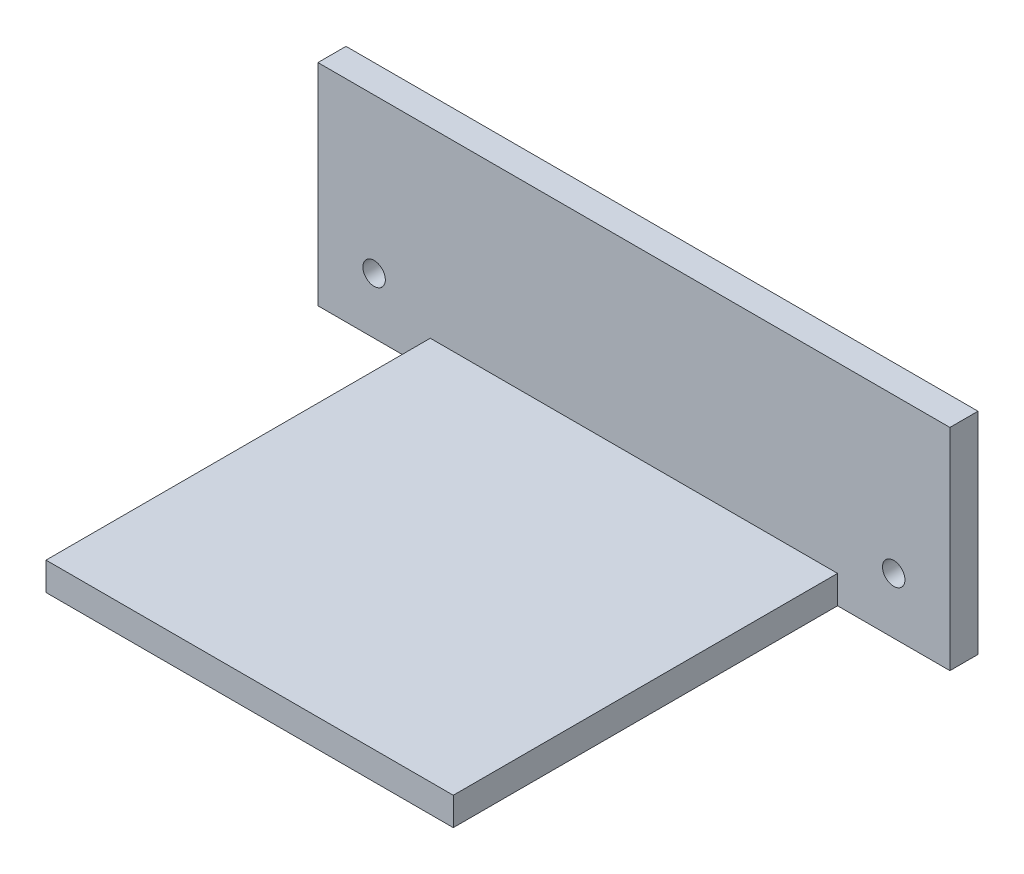
ISO-10303-21;
HEADER;
FILE_DESCRIPTION(('STEP AP214'),'2;1');
FILE_NAME('part.step','',(''),(''),'','','');
FILE_SCHEMA(('AUTOMOTIVE_DESIGN { 1 0 10303 214 1 1 1 1 }'));
ENDSEC;
DATA;
#1=APPLICATION_CONTEXT('core data for automotive mechanical design processes');
#2=APPLICATION_PROTOCOL_DEFINITION('international standard','automotive_design',2000,#1);
#3=PRODUCT_CONTEXT('',#1,'mechanical');
#4=PRODUCT('Part','Part','',(#3));
#5=PRODUCT_RELATED_PRODUCT_CATEGORY('part','',(#4));
#6=PRODUCT_DEFINITION_FORMATION('','',#4);
#7=PRODUCT_DEFINITION_CONTEXT('part definition',#1,'design');
#8=PRODUCT_DEFINITION('design','',#6,#7);
#9=PRODUCT_DEFINITION_SHAPE('','',#8);
#10=(LENGTH_UNIT() NAMED_UNIT(*) SI_UNIT(.MILLI.,.METRE.));
#11=(NAMED_UNIT(*) PLANE_ANGLE_UNIT() SI_UNIT($,.RADIAN.));
#12=(NAMED_UNIT(*) SI_UNIT($,.STERADIAN.) SOLID_ANGLE_UNIT());
#13=UNCERTAINTY_MEASURE_WITH_UNIT(LENGTH_MEASURE(1.E-05),#10,'distance_accuracy_value','');
#14=(GEOMETRIC_REPRESENTATION_CONTEXT(3) GLOBAL_UNCERTAINTY_ASSIGNED_CONTEXT((#13)) GLOBAL_UNIT_ASSIGNED_CONTEXT((#10,
#11,#12)) REPRESENTATION_CONTEXT('',''));
#15=CARTESIAN_POINT('',(0.,0.,0.));
#16=DIRECTION('',(0.,0.,1.));
#17=DIRECTION('',(1.,0.,0.));
#18=AXIS2_PLACEMENT_3D('',#15,#16,#17);
#19=CARTESIAN_POINT('',(-38.8972113815369,2.,0.));
#20=DIRECTION('',(1.,0.,0.));
#21=DIRECTION('',(0.,0.,-1.));
#22=AXIS2_PLACEMENT_3D('',#19,#20,#21);
#23=PLANE('',#22);
#24=DIRECTION('',(0.,0.,1.));
#25=VECTOR('',#24,1.);
#26=CARTESIAN_POINT('',(-38.8972113815369,2.,0.));
#27=LINE('',#26,#25);
#28=CARTESIAN_POINT('',(-38.8972113815369,2.,0.113319323773453));
#29=VERTEX_POINT('',#28);
#30=CARTESIAN_POINT('',(-38.8972113815369,2.,27.4750143885459));
#31=VERTEX_POINT('',#30);
#32=EDGE_CURVE('E156',#29,#31,#27,.T.);
#33=ORIENTED_EDGE('',*,*,#32,.F.);
#34=DIRECTION('',(0.,-1.,0.));
#35=VECTOR('',#34,1.);
#36=CARTESIAN_POINT('',(-38.8972113815369,2.,0.113319323773453));
#37=LINE('',#36,#35);
#38=CARTESIAN_POINT('',(-38.8972113815369,0.,0.113319323773453));
#39=VERTEX_POINT('',#38);
#40=EDGE_CURVE('E153',#29,#39,#37,.T.);
#41=ORIENTED_EDGE('',*,*,#40,.T.);
#42=DIRECTION('',(0.,0.,1.));
#43=VECTOR('',#42,1.);
#44=CARTESIAN_POINT('',(-38.8972113815369,0.,0.));
#45=LINE('',#44,#43);
#46=CARTESIAN_POINT('',(-38.8972113815369,0.,27.4750143885459));
#47=VERTEX_POINT('',#46);
#48=EDGE_CURVE('E155',#39,#47,#45,.T.);
#49=ORIENTED_EDGE('',*,*,#48,.T.);
#50=DIRECTION('',(0.,-1.,0.));
#51=VECTOR('',#50,1.);
#52=CARTESIAN_POINT('',(-38.8972113815369,2.,27.4750143885459));
#53=LINE('',#52,#51);
#54=EDGE_CURVE('E11',#31,#47,#53,.T.);
#55=ORIENTED_EDGE('',*,*,#54,.F.);
#56=EDGE_LOOP('',(#33,#41,#49,#55));
#57=FACE_BOUND('',#56,.T.);
#58=ADVANCED_FACE('F36',(#57),#23,.F.);
#59=CARTESIAN_POINT('',(-38.8972113815369,2.,27.4750143885459));
#60=DIRECTION('',(0.,0.,-1.));
#61=DIRECTION('',(-1.,0.,0.));
#62=AXIS2_PLACEMENT_3D('',#59,#60,#61);
#63=PLANE('',#62);
#64=DIRECTION('',(1.,0.,0.));
#65=VECTOR('',#64,1.);
#66=CARTESIAN_POINT('',(-38.8972113815369,0.,27.4750143885459));
#67=LINE('',#66,#65);
#68=CARTESIAN_POINT('',(-9.89721138153693,0.,27.4750143885459));
#69=VERTEX_POINT('',#68);
#70=EDGE_CURVE('E163',#47,#69,#67,.T.);
#71=ORIENTED_EDGE('',*,*,#70,.T.);
#72=DIRECTION('',(0.,-1.,0.));
#73=VECTOR('',#72,1.);
#74=CARTESIAN_POINT('',(-9.89721138153693,2.,27.4750143885459));
#75=LINE('',#74,#73);
#76=CARTESIAN_POINT('',(-9.89721138153693,2.,27.4750143885459));
#77=VERTEX_POINT('',#76);
#78=EDGE_CURVE('E43',#77,#69,#75,.T.);
#79=ORIENTED_EDGE('',*,*,#78,.F.);
#80=DIRECTION('',(1.,0.,0.));
#81=VECTOR('',#80,1.);
#82=CARTESIAN_POINT('',(-38.8972113815369,2.,27.4750143885459));
#83=LINE('',#82,#81);
#84=EDGE_CURVE('E158',#31,#77,#83,.T.);
#85=ORIENTED_EDGE('',*,*,#84,.F.);
#86=ORIENTED_EDGE('',*,*,#54,.T.);
#87=EDGE_LOOP('',(#71,#79,#85,#86));
#88=FACE_BOUND('',#87,.T.);
#89=ADVANCED_FACE('F211',(#88),#63,.F.);
#90=CARTESIAN_POINT('',(-9.89721138153693,2.,27.4750143885459));
#91=DIRECTION('',(-1.,0.,0.));
#92=DIRECTION('',(0.,0.,1.));
#93=AXIS2_PLACEMENT_3D('',#90,#91,#92);
#94=PLANE('',#93);
#95=DIRECTION('',(0.,0.,-1.));
#96=VECTOR('',#95,1.);
#97=CARTESIAN_POINT('',(-9.89721138153693,0.,27.4750143885459));
#98=LINE('',#97,#96);
#99=CARTESIAN_POINT('',(-9.89721138153693,0.,0.113319323773453));
#100=VERTEX_POINT('',#99);
#101=EDGE_CURVE('E58',#69,#100,#98,.T.);
#102=ORIENTED_EDGE('',*,*,#101,.T.);
#103=DIRECTION('',(0.,1.,0.));
#104=VECTOR('',#103,1.);
#105=CARTESIAN_POINT('',(-9.89721138153693,2.,0.113319323773453));
#106=LINE('',#105,#104);
#107=CARTESIAN_POINT('',(-9.89721138153693,2.,0.113319323773453));
#108=VERTEX_POINT('',#107);
#109=EDGE_CURVE('E151',#100,#108,#106,.T.);
#110=ORIENTED_EDGE('',*,*,#109,.T.);
#111=DIRECTION('',(0.,0.,-1.));
#112=VECTOR('',#111,1.);
#113=CARTESIAN_POINT('',(-9.89721138153693,2.,27.4750143885459));
#114=LINE('',#113,#112);
#115=EDGE_CURVE('E160',#77,#108,#114,.T.);
#116=ORIENTED_EDGE('',*,*,#115,.F.);
#117=ORIENTED_EDGE('',*,*,#78,.T.);
#118=EDGE_LOOP('',(#102,#110,#116,#117));
#119=FACE_BOUND('',#118,.T.);
#120=ADVANCED_FACE('F167',(#119),#94,.F.);
#121=CARTESIAN_POINT('',(0.,2.,0.));
#122=DIRECTION('',(0.,1.,0.));
#123=DIRECTION('',(0.,0.,1.));
#124=AXIS2_PLACEMENT_3D('',#121,#122,#123);
#125=PLANE('',#124);
#126=DIRECTION('',(1.,0.,0.));
#127=VECTOR('',#126,1.);
#128=CARTESIAN_POINT('',(0.,2.,0.113319323773453));
#129=LINE('',#128,#127);
#130=EDGE_CURVE('E50',#29,#108,#129,.T.);
#131=ORIENTED_EDGE('',*,*,#130,.F.);
#132=ORIENTED_EDGE('',*,*,#32,.T.);
#133=ORIENTED_EDGE('',*,*,#84,.T.);
#134=ORIENTED_EDGE('',*,*,#115,.T.);
#135=EDGE_LOOP('',(#131,#132,#133,#134));
#136=FACE_BOUND('',#135,.T.);
#137=ADVANCED_FACE('F206',(#136),#125,.T.);
#138=CARTESIAN_POINT('',(0.,0.,0.));
#139=DIRECTION('',(0.,1.,0.));
#140=DIRECTION('',(0.,0.,1.));
#141=AXIS2_PLACEMENT_3D('',#138,#139,#140);
#142=PLANE('',#141);
#143=ORIENTED_EDGE('',*,*,#48,.F.);
#144=DIRECTION('',(-1.,0.,0.));
#145=VECTOR('',#144,1.);
#146=CARTESIAN_POINT('',(-1.89721138153693,0.,0.113319323773453));
#147=LINE('',#146,#145);
#148=CARTESIAN_POINT('',(-46.8972113815369,0.,0.113319323773453));
#149=VERTEX_POINT('',#148);
#150=EDGE_CURVE('E141',#39,#149,#147,.T.);
#151=ORIENTED_EDGE('',*,*,#150,.T.);
#152=DIRECTION('',(0.,0.,-1.));
#153=VECTOR('',#152,1.);
#154=CARTESIAN_POINT('',(-46.8972113815369,0.,0.113319323773453));
#155=LINE('',#154,#153);
#156=CARTESIAN_POINT('',(-46.8972113815369,0.,-1.88668067622655));
#157=VERTEX_POINT('',#156);
#158=EDGE_CURVE('E108',#149,#157,#155,.T.);
#159=ORIENTED_EDGE('',*,*,#158,.T.);
#160=DIRECTION('',(-1.,0.,0.));
#161=VECTOR('',#160,1.);
#162=CARTESIAN_POINT('',(-1.89721138153693,0.,-1.88668067622655));
#163=LINE('',#162,#161);
#164=CARTESIAN_POINT('',(-1.89721138153693,0.,-1.88668067622655));
#165=VERTEX_POINT('',#164);
#166=EDGE_CURVE('E130',#165,#157,#163,.T.);
#167=ORIENTED_EDGE('',*,*,#166,.F.);
#168=DIRECTION('',(0.,0.,-1.));
#169=VECTOR('',#168,1.);
#170=CARTESIAN_POINT('',(-1.89721138153693,0.,0.113319323773453));
#171=LINE('',#170,#169);
#172=CARTESIAN_POINT('',(-1.89721138153693,0.,0.113319323773453));
#173=VERTEX_POINT('',#172);
#174=EDGE_CURVE('E128',#173,#165,#171,.T.);
#175=ORIENTED_EDGE('',*,*,#174,.F.);
#176=EDGE_CURVE('E138',#173,#100,#147,.T.);
#177=ORIENTED_EDGE('',*,*,#176,.T.);
#178=ORIENTED_EDGE('',*,*,#101,.F.);
#179=ORIENTED_EDGE('',*,*,#70,.F.);
#180=EDGE_LOOP('',(#143,#151,#159,#167,#175,#177,#178,#179));
#181=FACE_BOUND('',#180,.T.);
#182=ADVANCED_FACE('F173',(#181),#142,.F.);
#183=CARTESIAN_POINT('',(-1.89721138153693,15.,0.113319323773453));
#184=DIRECTION('',(0.,0.,1.));
#185=DIRECTION('',(1.,0.,0.));
#186=AXIS2_PLACEMENT_3D('',#183,#184,#185);
#187=PLANE('',#186);
#188=CARTESIAN_POINT('',(-5.89721138153693,4.,0.113319323773455));
#189=DIRECTION('',(0.,0.,1.));
#190=DIRECTION('',(1.,0.,0.));
#191=AXIS2_PLACEMENT_3D('',#188,#189,#190);
#192=CIRCLE('',#191,0.799999999999988);
#193=CARTESIAN_POINT('',(-5.09721138153694,4.,0.113319323773455));
#194=VERTEX_POINT('',#193);
#195=EDGE_CURVE('E187',#194,#194,#192,.T.);
#196=ORIENTED_EDGE('',*,*,#195,.F.);
#197=EDGE_LOOP('',(#196));
#198=FACE_BOUND('',#197,.T.);
#199=CARTESIAN_POINT('',(-42.8972113815369,4.,0.113319323773455));
#200=DIRECTION('',(0.,0.,1.));
#201=DIRECTION('',(1.,0.,0.));
#202=AXIS2_PLACEMENT_3D('',#199,#200,#201);
#203=CIRCLE('',#202,0.799999999999988);
#204=CARTESIAN_POINT('',(-42.0972113815369,4.,0.113319323773455));
#205=VERTEX_POINT('',#204);
#206=EDGE_CURVE('E179',#205,#205,#203,.T.);
#207=ORIENTED_EDGE('',*,*,#206,.F.);
#208=EDGE_LOOP('',(#207));
#209=FACE_BOUND('',#208,.T.);
#210=ORIENTED_EDGE('',*,*,#40,.F.);
#211=ORIENTED_EDGE('',*,*,#130,.T.);
#212=ORIENTED_EDGE('',*,*,#109,.F.);
#213=ORIENTED_EDGE('',*,*,#176,.F.);
#214=DIRECTION('',(0.,-1.,0.));
#215=VECTOR('',#214,1.);
#216=CARTESIAN_POINT('',(-1.89721138153693,15.,0.113319323773453));
#217=LINE('',#216,#215);
#218=CARTESIAN_POINT('',(-1.89721138153693,15.,0.113319323773453));
#219=VERTEX_POINT('',#218);
#220=EDGE_CURVE('E126',#219,#173,#217,.T.);
#221=ORIENTED_EDGE('',*,*,#220,.F.);
#222=DIRECTION('',(-1.,0.,0.));
#223=VECTOR('',#222,1.);
#224=CARTESIAN_POINT('',(-1.89721138153693,15.,0.113319323773453));
#225=LINE('',#224,#223);
#226=CARTESIAN_POINT('',(-46.8972113815369,15.,0.113319323773453));
#227=VERTEX_POINT('',#226);
#228=EDGE_CURVE('E118',#219,#227,#225,.T.);
#229=ORIENTED_EDGE('',*,*,#228,.T.);
#230=DIRECTION('',(0.,-1.,0.));
#231=VECTOR('',#230,1.);
#232=CARTESIAN_POINT('',(-46.8972113815369,15.,0.113319323773453));
#233=LINE('',#232,#231);
#234=EDGE_CURVE('E103',#227,#149,#233,.T.);
#235=ORIENTED_EDGE('',*,*,#234,.T.);
#236=ORIENTED_EDGE('',*,*,#150,.F.);
#237=EDGE_LOOP('',(#210,#211,#212,#213,#221,#229,#235,#236));
#238=FACE_BOUND('',#237,.T.);
#239=ADVANCED_FACE('F124',(#198,#209,#238),#187,.T.);
#240=CARTESIAN_POINT('',(-1.89721138153693,15.,0.113319323773453));
#241=DIRECTION('',(-1.,0.,0.));
#242=DIRECTION('',(0.,0.,1.));
#243=AXIS2_PLACEMENT_3D('',#240,#241,#242);
#244=PLANE('',#243);
#245=ORIENTED_EDGE('',*,*,#174,.T.);
#246=DIRECTION('',(0.,-1.,0.));
#247=VECTOR('',#246,1.);
#248=CARTESIAN_POINT('',(-1.89721138153693,15.,-1.88668067622655));
#249=LINE('',#248,#247);
#250=CARTESIAN_POINT('',(-1.89721138153693,15.,-1.88668067622655));
#251=VERTEX_POINT('',#250);
#252=EDGE_CURVE('E146',#251,#165,#249,.T.);
#253=ORIENTED_EDGE('',*,*,#252,.F.);
#254=DIRECTION('',(0.,0.,-1.));
#255=VECTOR('',#254,1.);
#256=CARTESIAN_POINT('',(-1.89721138153693,15.,0.113319323773453));
#257=LINE('',#256,#255);
#258=EDGE_CURVE('E113',#219,#251,#257,.T.);
#259=ORIENTED_EDGE('',*,*,#258,.F.);
#260=ORIENTED_EDGE('',*,*,#220,.T.);
#261=EDGE_LOOP('',(#245,#253,#259,#260));
#262=FACE_BOUND('',#261,.T.);
#263=ADVANCED_FACE('F197',(#262),#244,.F.);
#264=CARTESIAN_POINT('',(-1.89721138153693,15.,-1.88668067622655));
#265=DIRECTION('',(0.,0.,1.));
#266=DIRECTION('',(1.,0.,0.));
#267=AXIS2_PLACEMENT_3D('',#264,#265,#266);
#268=PLANE('',#267);
#269=CARTESIAN_POINT('',(-5.89721138153693,4.,-1.88668067622655));
#270=DIRECTION('',(0.,0.,1.));
#271=DIRECTION('',(1.,0.,0.));
#272=AXIS2_PLACEMENT_3D('',#269,#270,#271);
#273=CIRCLE('',#272,0.799999999999999);
#274=CARTESIAN_POINT('',(-5.09721138153693,4.,-1.88668067622655));
#275=VERTEX_POINT('',#274);
#276=EDGE_CURVE('E183',#275,#275,#273,.T.);
#277=ORIENTED_EDGE('',*,*,#276,.T.);
#278=EDGE_LOOP('',(#277));
#279=FACE_BOUND('',#278,.T.);
#280=CARTESIAN_POINT('',(-42.8972113815369,4.,-1.88668067622655));
#281=DIRECTION('',(0.,0.,1.));
#282=DIRECTION('',(1.,0.,0.));
#283=AXIS2_PLACEMENT_3D('',#280,#281,#282);
#284=CIRCLE('',#283,0.800000000000002);
#285=CARTESIAN_POINT('',(-42.0972113815369,4.,-1.88668067622655));
#286=VERTEX_POINT('',#285);
#287=EDGE_CURVE('E133',#286,#286,#284,.T.);
#288=ORIENTED_EDGE('',*,*,#287,.T.);
#289=EDGE_LOOP('',(#288));
#290=FACE_BOUND('',#289,.T.);
#291=ORIENTED_EDGE('',*,*,#166,.T.);
#292=DIRECTION('',(0.,-1.,0.));
#293=VECTOR('',#292,1.);
#294=CARTESIAN_POINT('',(-46.8972113815369,15.,-1.88668067622655));
#295=LINE('',#294,#293);
#296=CARTESIAN_POINT('',(-46.8972113815369,15.,-1.88668067622655));
#297=VERTEX_POINT('',#296);
#298=EDGE_CURVE('E112',#297,#157,#295,.T.);
#299=ORIENTED_EDGE('',*,*,#298,.F.);
#300=DIRECTION('',(-1.,0.,0.));
#301=VECTOR('',#300,1.);
#302=CARTESIAN_POINT('',(-1.89721138153693,15.,-1.88668067622655));
#303=LINE('',#302,#301);
#304=EDGE_CURVE('E120',#251,#297,#303,.T.);
#305=ORIENTED_EDGE('',*,*,#304,.F.);
#306=ORIENTED_EDGE('',*,*,#252,.T.);
#307=EDGE_LOOP('',(#291,#299,#305,#306));
#308=FACE_BOUND('',#307,.T.);
#309=ADVANCED_FACE('F203',(#279,#290,#308),#268,.F.);
#310=CARTESIAN_POINT('',(-46.8972113815369,15.,0.113319323773453));
#311=DIRECTION('',(-1.,0.,0.));
#312=DIRECTION('',(0.,0.,1.));
#313=AXIS2_PLACEMENT_3D('',#310,#311,#312);
#314=PLANE('',#313);
#315=ORIENTED_EDGE('',*,*,#158,.F.);
#316=ORIENTED_EDGE('',*,*,#234,.F.);
#317=DIRECTION('',(0.,0.,-1.));
#318=VECTOR('',#317,1.);
#319=CARTESIAN_POINT('',(-46.8972113815369,15.,0.113319323773453));
#320=LINE('',#319,#318);
#321=EDGE_CURVE('E106',#227,#297,#320,.T.);
#322=ORIENTED_EDGE('',*,*,#321,.T.);
#323=ORIENTED_EDGE('',*,*,#298,.T.);
#324=EDGE_LOOP('',(#315,#316,#322,#323));
#325=FACE_BOUND('',#324,.T.);
#326=ADVANCED_FACE('F105',(#325),#314,.T.);
#327=CARTESIAN_POINT('',(0.,15.,0.));
#328=DIRECTION('',(0.,-1.,0.));
#329=DIRECTION('',(0.,0.,-1.));
#330=AXIS2_PLACEMENT_3D('',#327,#328,#329);
#331=PLANE('',#330);
#332=ORIENTED_EDGE('',*,*,#228,.F.);
#333=ORIENTED_EDGE('',*,*,#258,.T.);
#334=ORIENTED_EDGE('',*,*,#304,.T.);
#335=ORIENTED_EDGE('',*,*,#321,.F.);
#336=EDGE_LOOP('',(#332,#333,#334,#335));
#337=FACE_BOUND('',#336,.T.);
#338=ADVANCED_FACE('F117',(#337),#331,.F.);
#339=CARTESIAN_POINT('',(-42.8972113815369,4.,0.113319323773453));
#340=DIRECTION('',(0.,0.,1.));
#341=DIRECTION('',(1.,0.,0.));
#342=AXIS2_PLACEMENT_3D('',#339,#340,#341);
#343=CYLINDRICAL_SURFACE('',#342,0.799999999999995);
#344=ORIENTED_EDGE('',*,*,#287,.F.);
#345=EDGE_LOOP('',(#344));
#346=FACE_BOUND('',#345,.T.);
#347=ORIENTED_EDGE('',*,*,#206,.T.);
#348=EDGE_LOOP('',(#347));
#349=FACE_BOUND('',#348,.T.);
#350=ADVANCED_FACE('F254',(#346,#349),#343,.F.);
#351=CARTESIAN_POINT('',(-5.89721138153693,4.,0.113319323773453));
#352=DIRECTION('',(0.,0.,1.));
#353=DIRECTION('',(1.,0.,0.));
#354=AXIS2_PLACEMENT_3D('',#351,#352,#353);
#355=CYLINDRICAL_SURFACE('',#354,0.799999999999993);
#356=ORIENTED_EDGE('',*,*,#276,.F.);
#357=EDGE_LOOP('',(#356));
#358=FACE_BOUND('',#357,.T.);
#359=ORIENTED_EDGE('',*,*,#195,.T.);
#360=EDGE_LOOP('',(#359));
#361=FACE_BOUND('',#360,.T.);
#362=ADVANCED_FACE('F193',(#358,#361),#355,.F.);
#363=CLOSED_SHELL('',(#58,#89,#120,#137,#182,#239,#263,#309,#326,#338,#350,#362));
#364=MANIFOLD_SOLID_BREP('B2',#363);
#365=ADVANCED_BREP_SHAPE_REPRESENTATION('',(#18,#364),#14);
#366=SHAPE_DEFINITION_REPRESENTATION(#9,#365);
ENDSEC;
END-ISO-10303-21;
